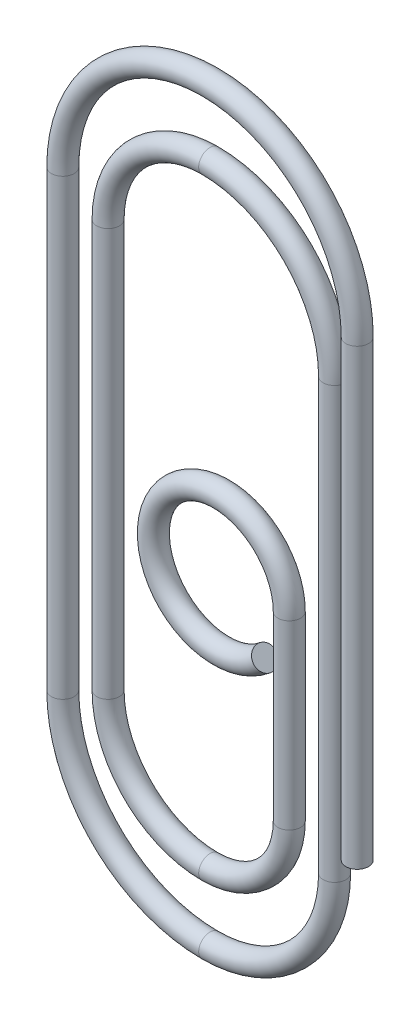
ISO-10303-21;
HEADER;
FILE_DESCRIPTION(('STEP AP214'),'2;1');
FILE_NAME('part.step','',(''),(''),'','','');
FILE_SCHEMA(('AUTOMOTIVE_DESIGN { 1 0 10303 214 1 1 1 1 }'));
ENDSEC;
DATA;
#1=APPLICATION_CONTEXT('core data for automotive mechanical design processes');
#2=APPLICATION_PROTOCOL_DEFINITION('international standard','automotive_design',2000,#1);
#3=PRODUCT_CONTEXT('',#1,'mechanical');
#4=PRODUCT('Part','Part','',(#3));
#5=PRODUCT_RELATED_PRODUCT_CATEGORY('part','',(#4));
#6=PRODUCT_DEFINITION_FORMATION('','',#4);
#7=PRODUCT_DEFINITION_CONTEXT('part definition',#1,'design');
#8=PRODUCT_DEFINITION('design','',#6,#7);
#9=PRODUCT_DEFINITION_SHAPE('','',#8);
#10=(LENGTH_UNIT() NAMED_UNIT(*) SI_UNIT(.MILLI.,.METRE.));
#11=(NAMED_UNIT(*) PLANE_ANGLE_UNIT() SI_UNIT($,.RADIAN.));
#12=(NAMED_UNIT(*) SI_UNIT($,.STERADIAN.) SOLID_ANGLE_UNIT());
#13=UNCERTAINTY_MEASURE_WITH_UNIT(LENGTH_MEASURE(1.E-05),#10,'distance_accuracy_value','');
#14=(GEOMETRIC_REPRESENTATION_CONTEXT(3) GLOBAL_UNCERTAINTY_ASSIGNED_CONTEXT((#13)) GLOBAL_UNIT_ASSIGNED_CONTEXT((#10,
#11,#12)) REPRESENTATION_CONTEXT('',''));
#15=CARTESIAN_POINT('',(0.,0.,0.));
#16=DIRECTION('',(0.,0.,1.));
#17=DIRECTION('',(1.,0.,0.));
#18=AXIS2_PLACEMENT_3D('',#15,#16,#17);
#19=CARTESIAN_POINT('',(30.,59.9999999999998,0.));
#20=DIRECTION('',(0.,-1.,0.));
#21=DIRECTION('',(1.,0.,0.));
#22=AXIS2_PLACEMENT_3D('',#19,#20,#21);
#23=CYLINDRICAL_SURFACE('',#22,2.5);
#24=CARTESIAN_POINT('',(30.,59.9999999999998,0.));
#25=DIRECTION('',(0.,1.,0.));
#26=DIRECTION('',(-1.,0.,0.));
#27=AXIS2_PLACEMENT_3D('',#24,#25,#26);
#28=CIRCLE('',#27,2.5);
#29=CARTESIAN_POINT('',(32.5,59.9999999999998,0.));
#30=VERTEX_POINT('',#29);
#31=EDGE_CURVE('E39',#30,#30,#28,.T.);
#32=ORIENTED_EDGE('',*,*,#31,.F.);
#33=EDGE_LOOP('',(#32));
#34=FACE_BOUND('',#33,.T.);
#35=CARTESIAN_POINT('',(30.,-40.0000000000002,0.));
#36=DIRECTION('',(0.,1.,0.));
#37=DIRECTION('',(-1.,0.,0.));
#38=AXIS2_PLACEMENT_3D('',#35,#36,#37);
#39=CIRCLE('',#38,2.5);
#40=CARTESIAN_POINT('',(27.5,-40.0000000000002,0.));
#41=VERTEX_POINT('',#40);
#42=EDGE_CURVE('E10',#41,#41,#39,.T.);
#43=ORIENTED_EDGE('',*,*,#42,.T.);
#44=EDGE_LOOP('',(#43));
#45=FACE_BOUND('',#44,.T.);
#46=ADVANCED_FACE('F33',(#34,#45),#23,.T.);
#47=CARTESIAN_POINT('',(-2.5,60.,0.));
#48=DIRECTION('',(0.,0.,-1.));
#49=DIRECTION('',(-1.,0.,0.));
#50=AXIS2_PLACEMENT_3D('',#47,#48,#49);
#51=TOROIDAL_SURFACE('',#50,32.5,2.5);
#52=CARTESIAN_POINT('',(-35.,60.0000000000002,0.));
#53=DIRECTION('',(0.,-1.,0.));
#54=DIRECTION('',(1.,0.,0.));
#55=AXIS2_PLACEMENT_3D('',#52,#53,#54);
#56=CIRCLE('',#55,2.5);
#57=CARTESIAN_POINT('',(-37.5,60.0000000000002,0.));
#58=VERTEX_POINT('',#57);
#59=EDGE_CURVE('E43',#58,#58,#56,.T.);
#60=CARTESIAN_POINT('',(-2.5,60.,0.));
#61=DIRECTION('',(0.,0.,-1.));
#62=DIRECTION('',(-1.,0.,0.));
#63=AXIS2_PLACEMENT_3D('',#60,#61,#62);
#64=CIRCLE('',#63,35.);
#65=EDGE_CURVE('',#58,#30,#64,.T.);
#66=ORIENTED_EDGE('',*,*,#59,.F.);
#67=ORIENTED_EDGE('',*,*,#31,.T.);
#68=ORIENTED_EDGE('',*,*,#65,.T.);
#69=ORIENTED_EDGE('',*,*,#65,.F.);
#70=EDGE_LOOP('',(#66,#68,#67,#69));
#71=FACE_BOUND('',#70,.T.);
#72=ADVANCED_FACE('F101',(#71),#51,.T.);
#73=CARTESIAN_POINT('',(-35.,-39.9999999999998,0.));
#74=DIRECTION('',(0.,1.,0.));
#75=DIRECTION('',(-1.,0.,0.));
#76=AXIS2_PLACEMENT_3D('',#73,#74,#75);
#77=CYLINDRICAL_SURFACE('',#76,2.5);
#78=CARTESIAN_POINT('',(-35.,-39.9999999999998,0.));
#79=DIRECTION('',(0.,-1.,0.));
#80=DIRECTION('',(1.,0.,0.));
#81=AXIS2_PLACEMENT_3D('',#78,#79,#80);
#82=CIRCLE('',#81,2.5);
#83=CARTESIAN_POINT('',(-37.5,-39.9999999999998,0.));
#84=VERTEX_POINT('',#83);
#85=EDGE_CURVE('E47',#84,#84,#82,.T.);
#86=CARTESIAN_POINT('',(-37.5,-39.9999999999998,0.));
#87=CARTESIAN_POINT('',(-37.5,-38.9583333333331,0.));
#88=CARTESIAN_POINT('',(-37.5,-37.9166666666664,0.));
#89=CARTESIAN_POINT('',(-37.5,-35.8333333333331,0.));
#90=CARTESIAN_POINT('',(-37.5,-34.7916666666664,0.));
#91=CARTESIAN_POINT('',(-37.5,-32.7083333333331,0.));
#92=CARTESIAN_POINT('',(-37.5,-31.6666666666664,0.));
#93=CARTESIAN_POINT('',(-37.5,-29.5833333333331,0.));
#94=CARTESIAN_POINT('',(-37.5,-28.5416666666664,0.));
#95=CARTESIAN_POINT('',(-37.5,-26.4583333333331,0.));
#96=CARTESIAN_POINT('',(-37.5,-25.4166666666664,0.));
#97=CARTESIAN_POINT('',(-37.5,-23.3333333333331,0.));
#98=CARTESIAN_POINT('',(-37.5,-22.2916666666664,0.));
#99=CARTESIAN_POINT('',(-37.5,-20.2083333333331,0.));
#100=CARTESIAN_POINT('',(-37.5,-19.1666666666664,0.));
#101=CARTESIAN_POINT('',(-37.5,-17.0833333333331,0.));
#102=CARTESIAN_POINT('',(-37.5,-16.0416666666664,0.));
#103=CARTESIAN_POINT('',(-37.5,-13.9583333333331,0.));
#104=CARTESIAN_POINT('',(-37.5,-12.9166666666664,0.));
#105=CARTESIAN_POINT('',(-37.5,-10.8333333333331,0.));
#106=CARTESIAN_POINT('',(-37.5,-9.79166666666644,0.));
#107=CARTESIAN_POINT('',(-37.5,-7.7083333333331,0.));
#108=CARTESIAN_POINT('',(-37.5,-6.66666666666644,0.));
#109=CARTESIAN_POINT('',(-37.5,-4.5833333333331,0.));
#110=CARTESIAN_POINT('',(-37.5,-3.54166666666643,0.));
#111=CARTESIAN_POINT('',(-37.5,-1.4583333333331,0.));
#112=CARTESIAN_POINT('',(-37.5,-0.416666666666436,0.));
#113=CARTESIAN_POINT('',(-37.5,1.6666666666669,0.));
#114=CARTESIAN_POINT('',(-37.5,2.70833333333356,0.));
#115=CARTESIAN_POINT('',(-37.5,4.7916666666669,0.));
#116=CARTESIAN_POINT('',(-37.5,5.83333333333356,0.));
#117=CARTESIAN_POINT('',(-37.5,7.91666666666689,0.));
#118=CARTESIAN_POINT('',(-37.5,8.95833333333356,0.));
#119=CARTESIAN_POINT('',(-37.5,11.0416666666669,0.));
#120=CARTESIAN_POINT('',(-37.5,12.0833333333336,0.));
#121=CARTESIAN_POINT('',(-37.5,14.1666666666669,0.));
#122=CARTESIAN_POINT('',(-37.5,15.2083333333336,0.));
#123=CARTESIAN_POINT('',(-37.5,17.2916666666669,0.));
#124=CARTESIAN_POINT('',(-37.5,18.3333333333336,0.));
#125=CARTESIAN_POINT('',(-37.5,20.4166666666669,0.));
#126=CARTESIAN_POINT('',(-37.5,21.4583333333336,0.));
#127=CARTESIAN_POINT('',(-37.5,23.5416666666669,0.));
#128=CARTESIAN_POINT('',(-37.5,24.5833333333335,0.));
#129=CARTESIAN_POINT('',(-37.5,26.6666666666669,0.));
#130=CARTESIAN_POINT('',(-37.5,27.7083333333336,0.));
#131=CARTESIAN_POINT('',(-37.5,29.7916666666669,0.));
#132=CARTESIAN_POINT('',(-37.5,30.8333333333336,0.));
#133=CARTESIAN_POINT('',(-37.5,32.9166666666669,0.));
#134=CARTESIAN_POINT('',(-37.5,33.9583333333336,0.));
#135=CARTESIAN_POINT('',(-37.5,36.0416666666669,0.));
#136=CARTESIAN_POINT('',(-37.5,37.0833333333335,0.));
#137=CARTESIAN_POINT('',(-37.5,39.1666666666669,0.));
#138=CARTESIAN_POINT('',(-37.5,40.2083333333335,0.));
#139=CARTESIAN_POINT('',(-37.5,42.2916666666669,0.));
#140=CARTESIAN_POINT('',(-37.5,43.3333333333335,0.));
#141=CARTESIAN_POINT('',(-37.5,45.4166666666669,0.));
#142=CARTESIAN_POINT('',(-37.5,46.4583333333336,0.));
#143=CARTESIAN_POINT('',(-37.5,48.5416666666669,0.));
#144=CARTESIAN_POINT('',(-37.5,49.5833333333336,0.));
#145=CARTESIAN_POINT('',(-37.5,51.6666666666669,0.));
#146=CARTESIAN_POINT('',(-37.5,52.7083333333335,0.));
#147=CARTESIAN_POINT('',(-37.5,54.7916666666669,0.));
#148=CARTESIAN_POINT('',(-37.5,55.8333333333335,0.));
#149=CARTESIAN_POINT('',(-37.5,57.9166666666669,0.));
#150=CARTESIAN_POINT('',(-37.5,58.9583333333335,0.));
#151=CARTESIAN_POINT('',(-37.5,60.0000000000002,0.));
#152=B_SPLINE_CURVE_WITH_KNOTS('',3,(#86,#87,#88,#89,#90,#91,#92,#93,#94,#95,#96,#97,#98,#99,
#100,#101,#102,#103,#104,#105,#106,#107,#108,#109,#110,#111,#112,#113,#114,#115,#116,#117,#118,
#119,#120,#121,#122,#123,#124,#125,#126,#127,#128,#129,#130,#131,#132,#133,#134,#135,#136,#137,
#138,#139,#140,#141,#142,#143,#144,#145,#146,#147,#148,#149,#150,#151),.UNSPECIFIED.,.F.,.F.,(4,
2,2,2,2,2,2,2,2,2,2,2,2,2,2,2,2,2,2,2,2,2,2,2,2,2,2,2,2,2,2,2,4),(0.,3.125,6.25,
9.37499999999999,12.5,15.625,18.75,21.875,25.,28.125,31.25,34.375,37.5,40.625,43.75,46.875,50.,
53.125,56.25,59.375,62.5,65.625,68.75,71.875,75.,78.125,81.25,84.375,87.5,90.625,93.75,96.875,
100.),.UNSPECIFIED.);
#153=EDGE_CURVE('BSEAM106',#84,#58,#152,.T.);
#154=ORIENTED_EDGE('',*,*,#85,.F.);
#155=ORIENTED_EDGE('',*,*,#59,.T.);
#156=ORIENTED_EDGE('',*,*,#153,.T.);
#157=ORIENTED_EDGE('',*,*,#153,.F.);
#158=EDGE_LOOP('',(#154,#156,#155,#157));
#159=FACE_BOUND('',#158,.T.);
#160=ADVANCED_FACE('F106',(#159),#77,.T.);
#161=CARTESIAN_POINT('',(-2.49999999999999,-40.,0.));
#162=DIRECTION('',(0.,0.,-1.));
#163=DIRECTION('',(-1.,0.,0.));
#164=AXIS2_PLACEMENT_3D('',#161,#162,#163);
#165=TOROIDAL_SURFACE('',#164,32.5,2.5);
#166=CARTESIAN_POINT('',(-2.50000000000019,-72.5,0.));
#167=DIRECTION('',(1.,0.,0.));
#168=DIRECTION('',(0.,1.,0.));
#169=AXIS2_PLACEMENT_3D('',#166,#167,#168);
#170=CIRCLE('',#169,2.5);
#171=CARTESIAN_POINT('',(-2.50000000000021,-75.,0.));
#172=VERTEX_POINT('',#171);
#173=EDGE_CURVE('E52',#172,#172,#170,.T.);
#174=CARTESIAN_POINT('',(-2.49999999999999,-40.,0.));
#175=DIRECTION('',(0.,0.,-1.));
#176=DIRECTION('',(-1.,0.,0.));
#177=AXIS2_PLACEMENT_3D('',#174,#175,#176);
#178=CIRCLE('',#177,35.);
#179=EDGE_CURVE('',#172,#84,#178,.T.);
#180=ORIENTED_EDGE('',*,*,#173,.F.);
#181=ORIENTED_EDGE('',*,*,#85,.T.);
#182=ORIENTED_EDGE('',*,*,#179,.T.);
#183=ORIENTED_EDGE('',*,*,#179,.F.);
#184=EDGE_LOOP('',(#180,#182,#181,#183));
#185=FACE_BOUND('',#184,.T.);
#186=ADVANCED_FACE('F111',(#185),#165,.T.);
#187=CARTESIAN_POINT('',(-2.49999999999999,-45.,0.));
#188=DIRECTION('',(0.,0.,-1.));
#189=DIRECTION('',(-1.,0.,0.));
#190=AXIS2_PLACEMENT_3D('',#187,#188,#189);
#191=TOROIDAL_SURFACE('',#190,27.5,2.5);
#192=CARTESIAN_POINT('',(25.,-45.0000000000002,0.));
#193=DIRECTION('',(0.,1.,0.));
#194=DIRECTION('',(-1.,0.,0.));
#195=AXIS2_PLACEMENT_3D('',#192,#193,#194);
#196=CIRCLE('',#195,2.5);
#197=CARTESIAN_POINT('',(27.5,-45.0000000000002,0.));
#198=VERTEX_POINT('',#197);
#199=EDGE_CURVE('E55',#198,#198,#196,.T.);
#200=CARTESIAN_POINT('',(-2.49999999999999,-45.,0.));
#201=DIRECTION('',(0.,0.,-1.));
#202=DIRECTION('',(-1.,0.,0.));
#203=AXIS2_PLACEMENT_3D('',#200,#201,#202);
#204=CIRCLE('',#203,30.);
#205=EDGE_CURVE('',#198,#172,#204,.T.);
#206=ORIENTED_EDGE('',*,*,#199,.F.);
#207=ORIENTED_EDGE('',*,*,#173,.T.);
#208=ORIENTED_EDGE('',*,*,#205,.T.);
#209=ORIENTED_EDGE('',*,*,#205,.F.);
#210=EDGE_LOOP('',(#206,#208,#207,#209));
#211=FACE_BOUND('',#210,.T.);
#212=ADVANCED_FACE('F118',(#211),#191,.T.);
#213=CARTESIAN_POINT('',(25.,49.9999999999998,0.));
#214=DIRECTION('',(0.,-1.,0.));
#215=DIRECTION('',(1.,0.,0.));
#216=AXIS2_PLACEMENT_3D('',#213,#214,#215);
#217=CYLINDRICAL_SURFACE('',#216,2.5);
#218=CARTESIAN_POINT('',(25.,49.9999999999998,0.));
#219=DIRECTION('',(0.,1.,0.));
#220=DIRECTION('',(-1.,0.,0.));
#221=AXIS2_PLACEMENT_3D('',#218,#219,#220);
#222=CIRCLE('',#221,2.5);
#223=CARTESIAN_POINT('',(27.5,49.9999999999998,0.));
#224=VERTEX_POINT('',#223);
#225=EDGE_CURVE('E58',#224,#224,#222,.T.);
#226=ORIENTED_EDGE('',*,*,#225,.F.);
#227=EDGE_LOOP('',(#226));
#228=FACE_BOUND('',#227,.T.);
#229=ORIENTED_EDGE('',*,*,#199,.T.);
#230=EDGE_LOOP('',(#229));
#231=FACE_BOUND('',#230,.T.);
#232=ADVANCED_FACE('F122',(#228,#231),#217,.T.);
#233=CARTESIAN_POINT('',(-2.49999999999999,50.,0.));
#234=DIRECTION('',(0.,0.,-1.));
#235=DIRECTION('',(-1.,0.,0.));
#236=AXIS2_PLACEMENT_3D('',#233,#234,#235);
#237=TOROIDAL_SURFACE('',#236,27.5,2.5);
#238=CARTESIAN_POINT('',(-2.49999999999979,77.5,0.));
#239=DIRECTION('',(-1.,0.,0.));
#240=DIRECTION('',(0.,-1.,0.));
#241=AXIS2_PLACEMENT_3D('',#238,#239,#240);
#242=CIRCLE('',#241,2.5);
#243=CARTESIAN_POINT('',(-2.49999999999978,80.,0.));
#244=VERTEX_POINT('',#243);
#245=EDGE_CURVE('E61',#244,#244,#242,.T.);
#246=CARTESIAN_POINT('',(-2.49999999999999,50.,0.));
#247=DIRECTION('',(0.,0.,-1.));
#248=DIRECTION('',(-1.,0.,0.));
#249=AXIS2_PLACEMENT_3D('',#246,#247,#248);
#250=CIRCLE('',#249,30.);
#251=EDGE_CURVE('',#244,#224,#250,.T.);
#252=ORIENTED_EDGE('',*,*,#245,.F.);
#253=ORIENTED_EDGE('',*,*,#225,.T.);
#254=ORIENTED_EDGE('',*,*,#251,.T.);
#255=ORIENTED_EDGE('',*,*,#251,.F.);
#256=EDGE_LOOP('',(#252,#254,#253,#255));
#257=FACE_BOUND('',#256,.T.);
#258=ADVANCED_FACE('F126',(#257),#237,.T.);
#259=CARTESIAN_POINT('',(-2.5,55.,0.));
#260=DIRECTION('',(0.,0.,-1.));
#261=DIRECTION('',(-1.,0.,0.));
#262=AXIS2_PLACEMENT_3D('',#259,#260,#261);
#263=TOROIDAL_SURFACE('',#262,22.5,2.5);
#264=CARTESIAN_POINT('',(-25.,55.0000000000002,0.));
#265=DIRECTION('',(0.,-1.,0.));
#266=DIRECTION('',(1.,0.,0.));
#267=AXIS2_PLACEMENT_3D('',#264,#265,#266);
#268=CIRCLE('',#267,2.5);
#269=CARTESIAN_POINT('',(-27.5,55.0000000000002,0.));
#270=VERTEX_POINT('',#269);
#271=EDGE_CURVE('E64',#270,#270,#268,.T.);
#272=CARTESIAN_POINT('',(-2.5,55.,0.));
#273=DIRECTION('',(0.,0.,-1.));
#274=DIRECTION('',(-1.,0.,0.));
#275=AXIS2_PLACEMENT_3D('',#272,#273,#274);
#276=CIRCLE('',#275,25.);
#277=EDGE_CURVE('',#270,#244,#276,.T.);
#278=ORIENTED_EDGE('',*,*,#271,.F.);
#279=ORIENTED_EDGE('',*,*,#245,.T.);
#280=ORIENTED_EDGE('',*,*,#277,.T.);
#281=ORIENTED_EDGE('',*,*,#277,.F.);
#282=EDGE_LOOP('',(#278,#280,#279,#281));
#283=FACE_BOUND('',#282,.T.);
#284=ADVANCED_FACE('F130',(#283),#263,.T.);
#285=CARTESIAN_POINT('',(-25.,-34.9999999999998,0.));
#286=DIRECTION('',(0.,1.,0.));
#287=DIRECTION('',(-1.,0.,0.));
#288=AXIS2_PLACEMENT_3D('',#285,#286,#287);
#289=CYLINDRICAL_SURFACE('',#288,2.5);
#290=CARTESIAN_POINT('',(-25.,-34.9999999999998,0.));
#291=DIRECTION('',(0.,-1.,0.));
#292=DIRECTION('',(1.,0.,0.));
#293=AXIS2_PLACEMENT_3D('',#290,#291,#292);
#294=CIRCLE('',#293,2.5);
#295=CARTESIAN_POINT('',(-27.5,-34.9999999999998,0.));
#296=VERTEX_POINT('',#295);
#297=EDGE_CURVE('E67',#296,#296,#294,.T.);
#298=CARTESIAN_POINT('',(-27.5,-34.9999999999998,0.));
#299=CARTESIAN_POINT('',(-27.5,-34.0624999999998,0.));
#300=CARTESIAN_POINT('',(-27.5,-33.1249999999998,0.));
#301=CARTESIAN_POINT('',(-27.5,-31.2499999999998,0.));
#302=CARTESIAN_POINT('',(-27.5,-30.3124999999998,0.));
#303=CARTESIAN_POINT('',(-27.5,-28.4374999999998,0.));
#304=CARTESIAN_POINT('',(-27.5,-27.4999999999998,0.));
#305=CARTESIAN_POINT('',(-27.5,-25.6249999999998,0.));
#306=CARTESIAN_POINT('',(-27.5,-24.6874999999998,0.));
#307=CARTESIAN_POINT('',(-27.5,-22.8124999999998,0.));
#308=CARTESIAN_POINT('',(-27.5,-21.8749999999998,0.));
#309=CARTESIAN_POINT('',(-27.5,-19.9999999999998,0.));
#310=CARTESIAN_POINT('',(-27.5,-19.0624999999998,0.));
#311=CARTESIAN_POINT('',(-27.5,-17.1874999999998,0.));
#312=CARTESIAN_POINT('',(-27.5,-16.2499999999998,0.));
#313=CARTESIAN_POINT('',(-27.5,-14.3749999999998,0.));
#314=CARTESIAN_POINT('',(-27.5,-13.4374999999998,0.));
#315=CARTESIAN_POINT('',(-27.5,-11.5624999999998,0.));
#316=CARTESIAN_POINT('',(-27.5,-10.6249999999998,0.));
#317=CARTESIAN_POINT('',(-27.5,-8.74999999999977,0.));
#318=CARTESIAN_POINT('',(-27.5,-7.81249999999977,0.));
#319=CARTESIAN_POINT('',(-27.5,-5.93749999999977,0.));
#320=CARTESIAN_POINT('',(-27.5,-4.99999999999977,0.));
#321=CARTESIAN_POINT('',(-27.5,-3.12499999999977,0.));
#322=CARTESIAN_POINT('',(-27.5,-2.18749999999978,0.));
#323=CARTESIAN_POINT('',(-27.5,-0.312499999999778,0.));
#324=CARTESIAN_POINT('',(-27.5,0.625000000000223,0.));
#325=CARTESIAN_POINT('',(-27.5,2.50000000000022,0.));
#326=CARTESIAN_POINT('',(-27.5,3.43750000000022,0.));
#327=CARTESIAN_POINT('',(-27.5,5.31250000000022,0.));
#328=CARTESIAN_POINT('',(-27.5,6.25000000000022,0.));
#329=CARTESIAN_POINT('',(-27.5,8.12500000000022,0.));
#330=CARTESIAN_POINT('',(-27.5,9.06250000000022,0.));
#331=CARTESIAN_POINT('',(-27.5,10.9375000000002,0.));
#332=CARTESIAN_POINT('',(-27.5,11.8750000000002,0.));
#333=CARTESIAN_POINT('',(-27.5,13.7500000000002,0.));
#334=CARTESIAN_POINT('',(-27.5,14.6875000000002,0.));
#335=CARTESIAN_POINT('',(-27.5,16.5625000000002,0.));
#336=CARTESIAN_POINT('',(-27.5,17.5000000000002,0.));
#337=CARTESIAN_POINT('',(-27.5,19.3750000000002,0.));
#338=CARTESIAN_POINT('',(-27.5,20.3125000000002,0.));
#339=CARTESIAN_POINT('',(-27.5,22.1875000000002,0.));
#340=CARTESIAN_POINT('',(-27.5,23.1250000000002,0.));
#341=CARTESIAN_POINT('',(-27.5,25.0000000000002,0.));
#342=CARTESIAN_POINT('',(-27.5,25.9375000000002,0.));
#343=CARTESIAN_POINT('',(-27.5,27.8125000000002,0.));
#344=CARTESIAN_POINT('',(-27.5,28.7500000000002,0.));
#345=CARTESIAN_POINT('',(-27.5,30.6250000000002,0.));
#346=CARTESIAN_POINT('',(-27.5,31.5625000000002,0.));
#347=CARTESIAN_POINT('',(-27.5,33.4375000000002,0.));
#348=CARTESIAN_POINT('',(-27.5,34.3750000000002,0.));
#349=CARTESIAN_POINT('',(-27.5,36.2500000000002,0.));
#350=CARTESIAN_POINT('',(-27.5,37.1875000000002,0.));
#351=CARTESIAN_POINT('',(-27.5,39.0625000000002,0.));
#352=CARTESIAN_POINT('',(-27.5,40.0000000000002,0.));
#353=CARTESIAN_POINT('',(-27.5,41.8750000000002,0.));
#354=CARTESIAN_POINT('',(-27.5,42.8125000000002,0.));
#355=CARTESIAN_POINT('',(-27.5,44.6875000000002,0.));
#356=CARTESIAN_POINT('',(-27.5,45.6250000000002,0.));
#357=CARTESIAN_POINT('',(-27.5,47.5000000000002,0.));
#358=CARTESIAN_POINT('',(-27.5,48.4375000000002,0.));
#359=CARTESIAN_POINT('',(-27.5,50.3125000000002,0.));
#360=CARTESIAN_POINT('',(-27.5,51.2500000000002,0.));
#361=CARTESIAN_POINT('',(-27.5,53.1250000000002,0.));
#362=CARTESIAN_POINT('',(-27.5,54.0625000000002,0.));
#363=CARTESIAN_POINT('',(-27.5,55.0000000000002,0.));
#364=B_SPLINE_CURVE_WITH_KNOTS('',3,(#298,#299,#300,#301,#302,#303,#304,#305,#306,#307,#308,
#309,#310,#311,#312,#313,#314,#315,#316,#317,#318,#319,#320,#321,#322,#323,#324,#325,#326,#327,
#328,#329,#330,#331,#332,#333,#334,#335,#336,#337,#338,#339,#340,#341,#342,#343,#344,#345,#346,
#347,#348,#349,#350,#351,#352,#353,#354,#355,#356,#357,#358,#359,#360,#361,#362,#363),
.UNSPECIFIED.,.F.,.F.,(4,2,2,2,2,2,2,2,2,2,2,2,2,2,2,2,2,2,2,2,2,2,2,2,2,2,2,2,2,2,2,2,4),(0.,
2.8125,5.62500000000001,8.4375,11.25,14.0625,16.875,19.6875,22.5,25.3125,28.125,30.9375,33.75,
36.5625,39.375,42.1875,45.,47.8125,50.625,53.4375,56.25,59.0625,61.875,64.6875,67.5,70.3125,
73.125,75.9375,78.75,81.5625,84.375,87.1875,90.),.UNSPECIFIED.);
#365=EDGE_CURVE('BSEAM134',#296,#270,#364,.T.);
#366=ORIENTED_EDGE('',*,*,#297,.F.);
#367=ORIENTED_EDGE('',*,*,#271,.T.);
#368=ORIENTED_EDGE('',*,*,#365,.T.);
#369=ORIENTED_EDGE('',*,*,#365,.F.);
#370=EDGE_LOOP('',(#366,#368,#367,#369));
#371=FACE_BOUND('',#370,.T.);
#372=ADVANCED_FACE('F134',(#371),#289,.T.);
#373=CARTESIAN_POINT('',(-2.49999999999999,-35.,0.));
#374=DIRECTION('',(0.,0.,-1.));
#375=DIRECTION('',(-1.,0.,0.));
#376=AXIS2_PLACEMENT_3D('',#373,#374,#375);
#377=TOROIDAL_SURFACE('',#376,22.5,2.5);
#378=CARTESIAN_POINT('',(-2.5000000000002,-57.5,0.));
#379=DIRECTION('',(1.,0.,0.));
#380=DIRECTION('',(0.,1.,0.));
#381=AXIS2_PLACEMENT_3D('',#378,#379,#380);
#382=CIRCLE('',#381,2.5);
#383=CARTESIAN_POINT('',(-2.50000000000023,-60.,0.));
#384=VERTEX_POINT('',#383);
#385=EDGE_CURVE('E70',#384,#384,#382,.T.);
#386=CARTESIAN_POINT('',(-2.49999999999999,-35.,0.));
#387=DIRECTION('',(0.,0.,-1.));
#388=DIRECTION('',(-1.,0.,0.));
#389=AXIS2_PLACEMENT_3D('',#386,#387,#388);
#390=CIRCLE('',#389,25.);
#391=EDGE_CURVE('',#384,#296,#390,.T.);
#392=ORIENTED_EDGE('',*,*,#385,.F.);
#393=ORIENTED_EDGE('',*,*,#297,.T.);
#394=ORIENTED_EDGE('',*,*,#391,.T.);
#395=ORIENTED_EDGE('',*,*,#391,.F.);
#396=EDGE_LOOP('',(#392,#394,#393,#395));
#397=FACE_BOUND('',#396,.T.);
#398=ADVANCED_FACE('F138',(#397),#377,.T.);
#399=CARTESIAN_POINT('',(-2.5,-40.,0.));
#400=DIRECTION('',(0.,0.,-1.));
#401=DIRECTION('',(-1.,0.,0.));
#402=AXIS2_PLACEMENT_3D('',#399,#400,#401);
#403=TOROIDAL_SURFACE('',#402,17.5,2.5);
#404=CARTESIAN_POINT('',(15.,-40.0000000000002,0.));
#405=DIRECTION('',(0.,1.,0.));
#406=DIRECTION('',(-1.,0.,0.));
#407=AXIS2_PLACEMENT_3D('',#404,#405,#406);
#408=CIRCLE('',#407,2.5);
#409=CARTESIAN_POINT('',(17.5,-40.0000000000002,0.));
#410=VERTEX_POINT('',#409);
#411=EDGE_CURVE('E73',#410,#410,#408,.T.);
#412=CARTESIAN_POINT('',(-2.5,-40.,0.));
#413=DIRECTION('',(0.,0.,-1.));
#414=DIRECTION('',(-1.,0.,0.));
#415=AXIS2_PLACEMENT_3D('',#412,#413,#414);
#416=CIRCLE('',#415,20.);
#417=EDGE_CURVE('',#410,#384,#416,.T.);
#418=ORIENTED_EDGE('',*,*,#411,.F.);
#419=ORIENTED_EDGE('',*,*,#385,.T.);
#420=ORIENTED_EDGE('',*,*,#417,.T.);
#421=ORIENTED_EDGE('',*,*,#417,.F.);
#422=EDGE_LOOP('',(#418,#420,#419,#421));
#423=FACE_BOUND('',#422,.T.);
#424=ADVANCED_FACE('F97',(#423),#403,.T.);
#425=CARTESIAN_POINT('',(15.,-2.16840434497101E-13,0.));
#426=DIRECTION('',(0.,-1.,0.));
#427=DIRECTION('',(1.,0.,0.));
#428=AXIS2_PLACEMENT_3D('',#425,#426,#427);
#429=CYLINDRICAL_SURFACE('',#428,2.5);
#430=CARTESIAN_POINT('',(15.,-2.16840434497101E-13,0.));
#431=DIRECTION('',(0.,1.,0.));
#432=DIRECTION('',(-1.,0.,0.));
#433=AXIS2_PLACEMENT_3D('',#430,#431,#432);
#434=CIRCLE('',#433,2.5);
#435=CARTESIAN_POINT('',(17.5,-2.52980506913284E-13,0.));
#436=VERTEX_POINT('',#435);
#437=EDGE_CURVE('E76',#436,#436,#434,.T.);
#438=ORIENTED_EDGE('',*,*,#437,.F.);
#439=EDGE_LOOP('',(#438));
#440=FACE_BOUND('',#439,.T.);
#441=ORIENTED_EDGE('',*,*,#411,.T.);
#442=EDGE_LOOP('',(#441));
#443=FACE_BOUND('',#442,.T.);
#444=ADVANCED_FACE('F88',(#440,#443),#429,.T.);
#445=CARTESIAN_POINT('',(0.,0.,0.));
#446=DIRECTION('',(0.,0.,1.));
#447=DIRECTION('',(1.,0.,0.));
#448=AXIS2_PLACEMENT_3D('',#445,#446,#447);
#449=TOROIDAL_SURFACE('',#448,15.,2.5);
#450=CARTESIAN_POINT('',(9.64181414529812,-11.4906666467846,0.));
#451=DIRECTION('',(0.766044443118976,0.642787609686541,0.));
#452=DIRECTION('',(-0.642787609686541,0.766044443118976,0.));
#453=AXIS2_PLACEMENT_3D('',#450,#451,#452);
#454=CIRCLE('',#453,2.5);
#455=CARTESIAN_POINT('',(11.2487831695145,-13.4057777545821,0.));
#456=VERTEX_POINT('',#455);
#457=EDGE_CURVE('E79',#456,#456,#454,.T.);
#458=CARTESIAN_POINT('',(0.,0.,0.));
#459=DIRECTION('',(0.,0.,1.));
#460=DIRECTION('',(1.,0.,0.));
#461=AXIS2_PLACEMENT_3D('',#458,#459,#460);
#462=CIRCLE('',#461,17.5);
#463=EDGE_CURVE('',#436,#456,#462,.T.);
#464=ORIENTED_EDGE('',*,*,#437,.T.);
#465=ORIENTED_EDGE('',*,*,#457,.F.);
#466=ORIENTED_EDGE('',*,*,#463,.T.);
#467=ORIENTED_EDGE('',*,*,#463,.F.);
#468=EDGE_LOOP('',(#464,#466,#465,#467));
#469=FACE_BOUND('',#468,.T.);
#470=ADVANCED_FACE('F85',(#469),#449,.T.);
#471=CARTESIAN_POINT('',(30.,-40.0000000000002,0.));
#472=DIRECTION('',(0.,1.,0.));
#473=DIRECTION('',(-1.,0.,0.));
#474=AXIS2_PLACEMENT_3D('',#471,#472,#473);
#475=PLANE('',#474);
#476=ORIENTED_EDGE('',*,*,#42,.F.);
#477=EDGE_LOOP('',(#476));
#478=FACE_BOUND('',#477,.T.);
#479=ADVANCED_FACE('F87',(#478),#475,.F.);
#480=CARTESIAN_POINT('',(9.64181414529812,-11.4906666467846,0.));
#481=DIRECTION('',(0.766044443118976,0.642787609686541,0.));
#482=DIRECTION('',(-0.642787609686541,0.766044443118976,0.));
#483=AXIS2_PLACEMENT_3D('',#480,#481,#482);
#484=PLANE('',#483);
#485=ORIENTED_EDGE('',*,*,#457,.T.);
#486=EDGE_LOOP('',(#485));
#487=FACE_BOUND('',#486,.T.);
#488=ADVANCED_FACE('F83',(#487),#484,.T.);
#489=CLOSED_SHELL('',(#46,#72,#160,#186,#212,#232,#258,#284,#372,#398,#424,#444,#470,#479,#488));
#490=MANIFOLD_SOLID_BREP('B2',#489);
#491=ADVANCED_BREP_SHAPE_REPRESENTATION('',(#18,#490),#14);
#492=SHAPE_DEFINITION_REPRESENTATION(#9,#491);
ENDSEC;
END-ISO-10303-21;
